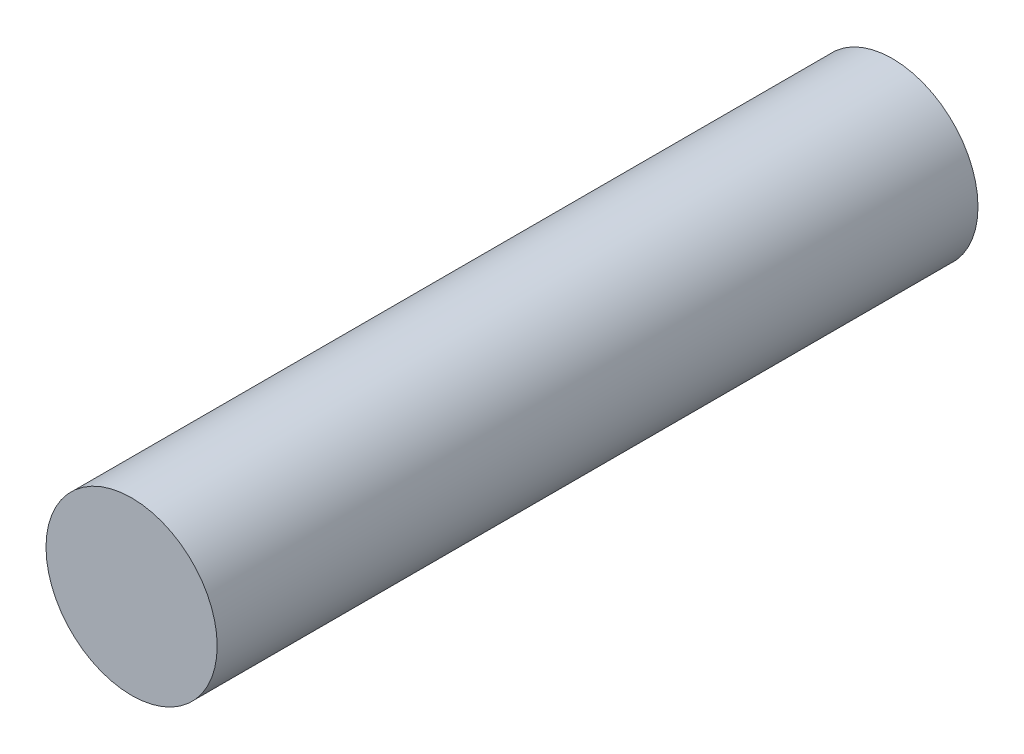
ISO-10303-21;
HEADER;
FILE_DESCRIPTION(('STEP AP214'),'2;1');
FILE_NAME('part.step','',(''),(''),'','','');
FILE_SCHEMA(('AUTOMOTIVE_DESIGN { 1 0 10303 214 1 1 1 1 }'));
ENDSEC;
DATA;
#1=APPLICATION_CONTEXT('core data for automotive mechanical design processes');
#2=APPLICATION_PROTOCOL_DEFINITION('international standard','automotive_design',2000,#1);
#3=PRODUCT_CONTEXT('',#1,'mechanical');
#4=PRODUCT('Part','Part','',(#3));
#5=PRODUCT_RELATED_PRODUCT_CATEGORY('part','',(#4));
#6=PRODUCT_DEFINITION_FORMATION('','',#4);
#7=PRODUCT_DEFINITION_CONTEXT('part definition',#1,'design');
#8=PRODUCT_DEFINITION('design','',#6,#7);
#9=PRODUCT_DEFINITION_SHAPE('','',#8);
#10=(LENGTH_UNIT() NAMED_UNIT(*) SI_UNIT(.MILLI.,.METRE.));
#11=(NAMED_UNIT(*) PLANE_ANGLE_UNIT() SI_UNIT($,.RADIAN.));
#12=(NAMED_UNIT(*) SI_UNIT($,.STERADIAN.) SOLID_ANGLE_UNIT());
#13=UNCERTAINTY_MEASURE_WITH_UNIT(LENGTH_MEASURE(1.E-05),#10,'distance_accuracy_value','');
#14=(GEOMETRIC_REPRESENTATION_CONTEXT(3) GLOBAL_UNCERTAINTY_ASSIGNED_CONTEXT((#13)) GLOBAL_UNIT_ASSIGNED_CONTEXT((#10,
#11,#12)) REPRESENTATION_CONTEXT('',''));
#15=CARTESIAN_POINT('',(0.,0.,0.));
#16=DIRECTION('',(0.,0.,1.));
#17=DIRECTION('',(1.,0.,0.));
#18=AXIS2_PLACEMENT_3D('',#15,#16,#17);
#19=CARTESIAN_POINT('',(0.,0.,40.));
#20=DIRECTION('',(0.,0.,-1.));
#21=DIRECTION('',(-1.,0.,0.));
#22=AXIS2_PLACEMENT_3D('',#19,#20,#21);
#23=CYLINDRICAL_SURFACE('',#22,9.);
#24=CARTESIAN_POINT('',(0.,0.,40.));
#25=DIRECTION('',(0.,0.,1.));
#26=DIRECTION('',(1.,0.,0.));
#27=AXIS2_PLACEMENT_3D('',#24,#25,#26);
#28=CIRCLE('',#27,9.);
#29=CARTESIAN_POINT('',(9.,0.,40.));
#30=VERTEX_POINT('',#29);
#31=EDGE_CURVE('E10',#30,#30,#28,.T.);
#32=ORIENTED_EDGE('',*,*,#31,.F.);
#33=EDGE_LOOP('',(#32));
#34=FACE_BOUND('',#33,.T.);
#35=CARTESIAN_POINT('',(0.,0.,-40.));
#36=DIRECTION('',(0.,0.,1.));
#37=DIRECTION('',(1.,0.,0.));
#38=AXIS2_PLACEMENT_3D('',#35,#36,#37);
#39=CIRCLE('',#38,9.);
#40=CARTESIAN_POINT('',(9.,0.,-40.));
#41=VERTEX_POINT('',#40);
#42=EDGE_CURVE('E31',#41,#41,#39,.T.);
#43=ORIENTED_EDGE('',*,*,#42,.T.);
#44=EDGE_LOOP('',(#43));
#45=FACE_BOUND('',#44,.T.);
#46=ADVANCED_FACE('F28',(#34,#45),#23,.T.);
#47=CARTESIAN_POINT('',(0.,0.,40.));
#48=DIRECTION('',(0.,0.,1.));
#49=DIRECTION('',(1.,0.,0.));
#50=AXIS2_PLACEMENT_3D('',#47,#48,#49);
#51=PLANE('',#50);
#52=ORIENTED_EDGE('',*,*,#31,.T.);
#53=EDGE_LOOP('',(#52));
#54=FACE_BOUND('',#53,.T.);
#55=ADVANCED_FACE('F43',(#54),#51,.T.);
#56=CARTESIAN_POINT('',(0.,0.,-40.));
#57=DIRECTION('',(0.,0.,1.));
#58=DIRECTION('',(1.,0.,0.));
#59=AXIS2_PLACEMENT_3D('',#56,#57,#58);
#60=PLANE('',#59);
#61=ORIENTED_EDGE('',*,*,#42,.F.);
#62=EDGE_LOOP('',(#61));
#63=FACE_BOUND('',#62,.T.);
#64=ADVANCED_FACE('F41',(#63),#60,.F.);
#65=CLOSED_SHELL('',(#46,#55,#64));
#66=MANIFOLD_SOLID_BREP('B2',#65);
#67=ADVANCED_BREP_SHAPE_REPRESENTATION('',(#18,#66),#14);
#68=SHAPE_DEFINITION_REPRESENTATION(#9,#67);
ENDSEC;
END-ISO-10303-21;
